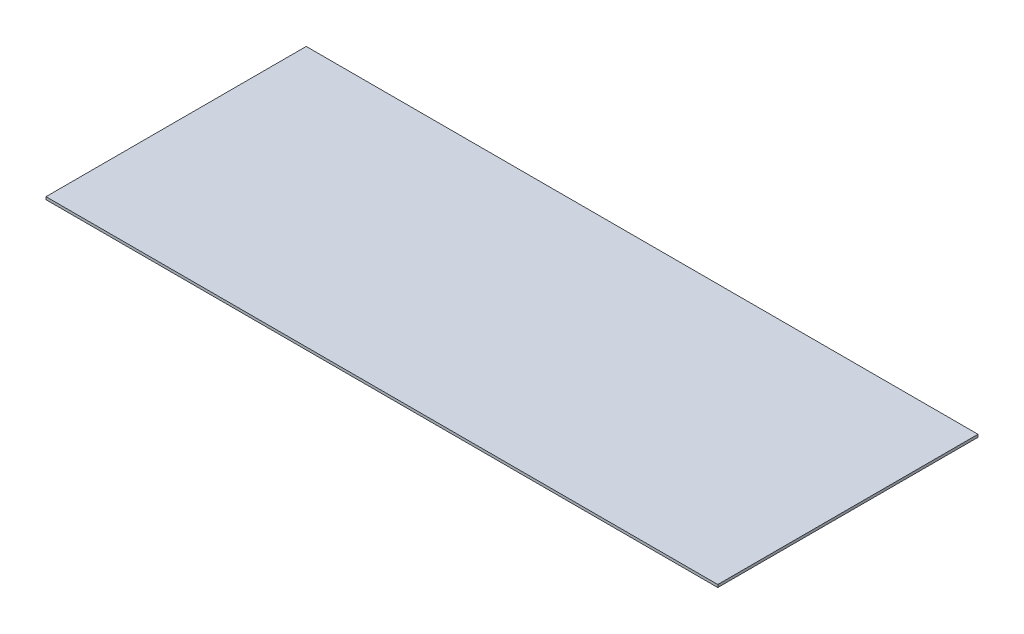
ISO-10303-21;
HEADER;
FILE_DESCRIPTION(('STEP AP214'),'2;1');
FILE_NAME('part.step','',(''),(''),'','','');
FILE_SCHEMA(('AUTOMOTIVE_DESIGN { 1 0 10303 214 1 1 1 1 }'));
ENDSEC;
DATA;
#1=APPLICATION_CONTEXT('core data for automotive mechanical design processes');
#2=APPLICATION_PROTOCOL_DEFINITION('international standard','automotive_design',2000,#1);
#3=PRODUCT_CONTEXT('',#1,'mechanical');
#4=PRODUCT('Part','Part','',(#3));
#5=PRODUCT_RELATED_PRODUCT_CATEGORY('part','',(#4));
#6=PRODUCT_DEFINITION_FORMATION('','',#4);
#7=PRODUCT_DEFINITION_CONTEXT('part definition',#1,'design');
#8=PRODUCT_DEFINITION('design','',#6,#7);
#9=PRODUCT_DEFINITION_SHAPE('','',#8);
#10=(LENGTH_UNIT() NAMED_UNIT(*) SI_UNIT(.MILLI.,.METRE.));
#11=(NAMED_UNIT(*) PLANE_ANGLE_UNIT() SI_UNIT($,.RADIAN.));
#12=(NAMED_UNIT(*) SI_UNIT($,.STERADIAN.) SOLID_ANGLE_UNIT());
#13=UNCERTAINTY_MEASURE_WITH_UNIT(LENGTH_MEASURE(1.E-05),#10,'distance_accuracy_value','');
#14=(GEOMETRIC_REPRESENTATION_CONTEXT(3) GLOBAL_UNCERTAINTY_ASSIGNED_CONTEXT((#13)) GLOBAL_UNIT_ASSIGNED_CONTEXT((#10,
#11,#12)) REPRESENTATION_CONTEXT('',''));
#15=CARTESIAN_POINT('',(0.,0.,0.));
#16=DIRECTION('',(0.,0.,1.));
#17=DIRECTION('',(1.,0.,0.));
#18=AXIS2_PLACEMENT_3D('',#15,#16,#17);
#19=CARTESIAN_POINT('',(-150.8125,0.5969,58.42));
#20=DIRECTION('',(1.,0.,0.));
#21=DIRECTION('',(0.,0.,-1.));
#22=AXIS2_PLACEMENT_3D('',#19,#20,#21);
#23=PLANE('',#22);
#24=DIRECTION('',(0.,0.,-1.));
#25=VECTOR('',#24,1.);
#26=CARTESIAN_POINT('',(-150.8125,0.5969,58.42));
#27=LINE('',#26,#25);
#28=CARTESIAN_POINT('',(-150.8125,0.5969,58.42));
#29=VERTEX_POINT('',#28);
#30=CARTESIAN_POINT('',(-150.8125,0.5969,-58.42));
#31=VERTEX_POINT('',#30);
#32=EDGE_CURVE('E96',#29,#31,#27,.T.);
#33=ORIENTED_EDGE('',*,*,#32,.T.);
#34=DIRECTION('',(0.,-1.,0.));
#35=VECTOR('',#34,1.);
#36=CARTESIAN_POINT('',(-150.8125,0.5969,-58.42));
#37=LINE('',#36,#35);
#38=CARTESIAN_POINT('',(-150.8125,-0.5969,-58.42));
#39=VERTEX_POINT('',#38);
#40=EDGE_CURVE('E91',#31,#39,#37,.T.);
#41=ORIENTED_EDGE('',*,*,#40,.T.);
#42=DIRECTION('',(0.,0.,-1.));
#43=VECTOR('',#42,1.);
#44=CARTESIAN_POINT('',(-150.8125,-0.5969,58.42));
#45=LINE('',#44,#43);
#46=CARTESIAN_POINT('',(-150.8125,-0.5969,58.42));
#47=VERTEX_POINT('',#46);
#48=EDGE_CURVE('E11',#47,#39,#45,.T.);
#49=ORIENTED_EDGE('',*,*,#48,.F.);
#50=DIRECTION('',(0.,-1.,0.));
#51=VECTOR('',#50,1.);
#52=CARTESIAN_POINT('',(-150.8125,0.5969,58.42));
#53=LINE('',#52,#51);
#54=EDGE_CURVE('E102',#29,#47,#53,.T.);
#55=ORIENTED_EDGE('',*,*,#54,.F.);
#56=EDGE_LOOP('',(#33,#41,#49,#55));
#57=FACE_BOUND('',#56,.T.);
#58=ADVANCED_FACE('F39',(#57),#23,.F.);
#59=CARTESIAN_POINT('',(150.8125,-0.5969,58.42));
#60=DIRECTION('',(0.,1.,0.));
#61=DIRECTION('',(0.,0.,1.));
#62=AXIS2_PLACEMENT_3D('',#59,#60,#61);
#63=PLANE('',#62);
#64=ORIENTED_EDGE('',*,*,#48,.T.);
#65=DIRECTION('',(1.,0.,0.));
#66=VECTOR('',#65,1.);
#67=CARTESIAN_POINT('',(150.8125,-0.5969,-58.42));
#68=LINE('',#67,#66);
#69=CARTESIAN_POINT('',(150.8125,-0.5969,-58.42));
#70=VERTEX_POINT('',#69);
#71=EDGE_CURVE('E81',#39,#70,#68,.T.);
#72=ORIENTED_EDGE('',*,*,#71,.T.);
#73=DIRECTION('',(0.,0.,-1.));
#74=VECTOR('',#73,1.);
#75=CARTESIAN_POINT('',(150.8125,-0.5969,58.42));
#76=LINE('',#75,#74);
#77=CARTESIAN_POINT('',(150.8125,-0.5969,58.42));
#78=VERTEX_POINT('',#77);
#79=EDGE_CURVE('E46',#78,#70,#76,.T.);
#80=ORIENTED_EDGE('',*,*,#79,.F.);
#81=DIRECTION('',(1.,0.,0.));
#82=VECTOR('',#81,1.);
#83=CARTESIAN_POINT('',(150.8125,-0.5969,58.42));
#84=LINE('',#83,#82);
#85=EDGE_CURVE('E82',#47,#78,#84,.T.);
#86=ORIENTED_EDGE('',*,*,#85,.F.);
#87=EDGE_LOOP('',(#64,#72,#80,#86));
#88=FACE_BOUND('',#87,.T.);
#89=ADVANCED_FACE('F79',(#88),#63,.F.);
#90=CARTESIAN_POINT('',(150.8125,0.5969,58.42));
#91=DIRECTION('',(-1.,0.,0.));
#92=DIRECTION('',(0.,0.,1.));
#93=AXIS2_PLACEMENT_3D('',#90,#91,#92);
#94=PLANE('',#93);
#95=ORIENTED_EDGE('',*,*,#79,.T.);
#96=DIRECTION('',(0.,1.,0.));
#97=VECTOR('',#96,1.);
#98=CARTESIAN_POINT('',(150.8125,0.5969,-58.42));
#99=LINE('',#98,#97);
#100=CARTESIAN_POINT('',(150.8125,0.5969,-58.42));
#101=VERTEX_POINT('',#100);
#102=EDGE_CURVE('E94',#70,#101,#99,.T.);
#103=ORIENTED_EDGE('',*,*,#102,.T.);
#104=DIRECTION('',(0.,0.,-1.));
#105=VECTOR('',#104,1.);
#106=CARTESIAN_POINT('',(150.8125,0.5969,58.42));
#107=LINE('',#106,#105);
#108=CARTESIAN_POINT('',(150.8125,0.5969,58.42));
#109=VERTEX_POINT('',#108);
#110=EDGE_CURVE('E108',#109,#101,#107,.T.);
#111=ORIENTED_EDGE('',*,*,#110,.F.);
#112=DIRECTION('',(0.,1.,0.));
#113=VECTOR('',#112,1.);
#114=CARTESIAN_POINT('',(150.8125,0.5969,58.42));
#115=LINE('',#114,#113);
#116=EDGE_CURVE('E58',#78,#109,#115,.T.);
#117=ORIENTED_EDGE('',*,*,#116,.F.);
#118=EDGE_LOOP('',(#95,#103,#111,#117));
#119=FACE_BOUND('',#118,.T.);
#120=ADVANCED_FACE('F110',(#119),#94,.F.);
#121=CARTESIAN_POINT('',(150.8125,0.5969,58.42));
#122=DIRECTION('',(0.,-1.,0.));
#123=DIRECTION('',(0.,0.,-1.));
#124=AXIS2_PLACEMENT_3D('',#121,#122,#123);
#125=PLANE('',#124);
#126=ORIENTED_EDGE('',*,*,#110,.T.);
#127=DIRECTION('',(-1.,0.,0.));
#128=VECTOR('',#127,1.);
#129=CARTESIAN_POINT('',(150.8125,0.5969,-58.42));
#130=LINE('',#129,#128);
#131=EDGE_CURVE('E100',#101,#31,#130,.T.);
#132=ORIENTED_EDGE('',*,*,#131,.T.);
#133=ORIENTED_EDGE('',*,*,#32,.F.);
#134=DIRECTION('',(-1.,0.,0.));
#135=VECTOR('',#134,1.);
#136=CARTESIAN_POINT('',(150.8125,0.5969,58.42));
#137=LINE('',#136,#135);
#138=EDGE_CURVE('E53',#109,#29,#137,.T.);
#139=ORIENTED_EDGE('',*,*,#138,.F.);
#140=EDGE_LOOP('',(#126,#132,#133,#139));
#141=FACE_BOUND('',#140,.T.);
#142=ADVANCED_FACE('F112',(#141),#125,.F.);
#143=CARTESIAN_POINT('',(0.,0.,58.42));
#144=DIRECTION('',(0.,0.,-1.));
#145=DIRECTION('',(-1.,0.,0.));
#146=AXIS2_PLACEMENT_3D('',#143,#144,#145);
#147=PLANE('',#146);
#148=ORIENTED_EDGE('',*,*,#54,.T.);
#149=ORIENTED_EDGE('',*,*,#85,.T.);
#150=ORIENTED_EDGE('',*,*,#116,.T.);
#151=ORIENTED_EDGE('',*,*,#138,.T.);
#152=EDGE_LOOP('',(#148,#149,#150,#151));
#153=FACE_BOUND('',#152,.T.);
#154=ADVANCED_FACE('F113',(#153),#147,.F.);
#155=CARTESIAN_POINT('',(0.,0.,-58.42));
#156=DIRECTION('',(0.,0.,-1.));
#157=DIRECTION('',(-1.,0.,0.));
#158=AXIS2_PLACEMENT_3D('',#155,#156,#157);
#159=PLANE('',#158);
#160=ORIENTED_EDGE('',*,*,#40,.F.);
#161=ORIENTED_EDGE('',*,*,#131,.F.);
#162=ORIENTED_EDGE('',*,*,#102,.F.);
#163=ORIENTED_EDGE('',*,*,#71,.F.);
#164=EDGE_LOOP('',(#160,#161,#162,#163));
#165=FACE_BOUND('',#164,.T.);
#166=ADVANCED_FACE('F89',(#165),#159,.T.);
#167=CLOSED_SHELL('',(#58,#89,#120,#142,#154,#166));
#168=MANIFOLD_SOLID_BREP('B2',#167);
#169=ADVANCED_BREP_SHAPE_REPRESENTATION('',(#18,#168),#14);
#170=SHAPE_DEFINITION_REPRESENTATION(#9,#169);
ENDSEC;
END-ISO-10303-21;
